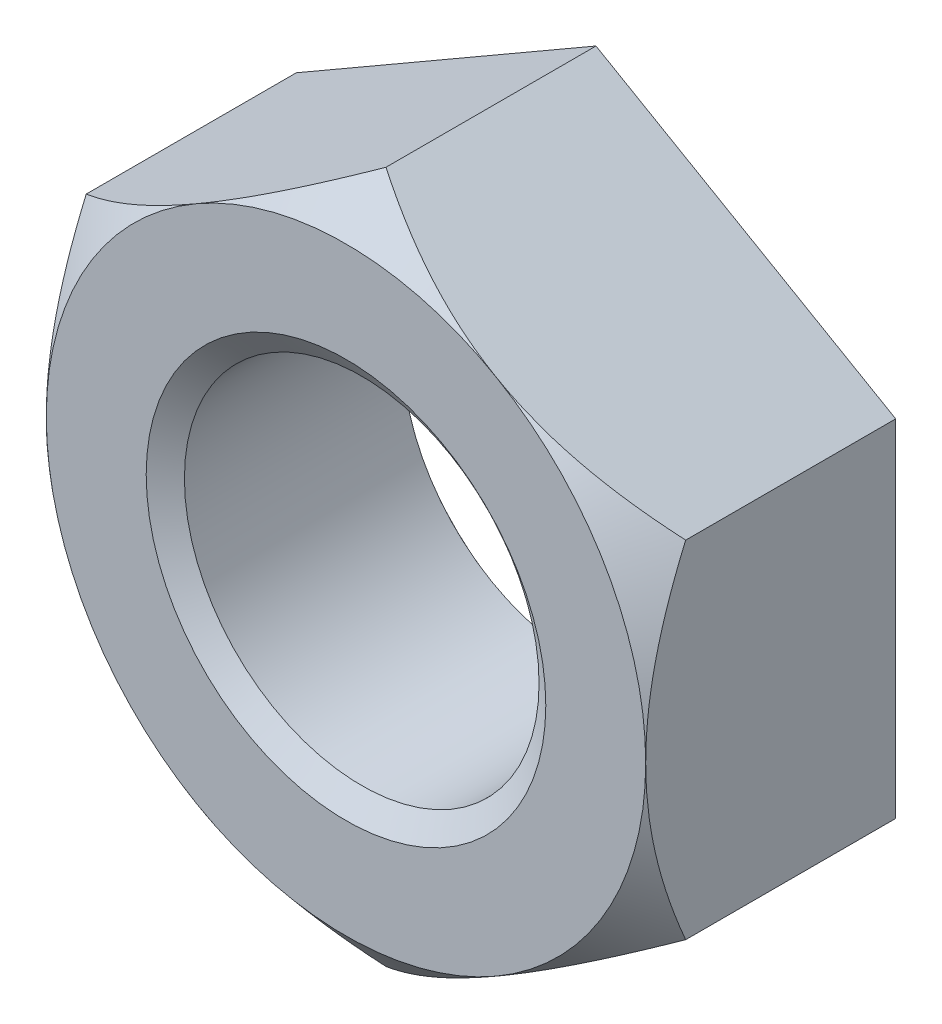
ISO-10303-21;
HEADER;
FILE_DESCRIPTION(('STEP AP214'),'2;1');
FILE_NAME('part.step','',(''),(''),'','','');
FILE_SCHEMA(('AUTOMOTIVE_DESIGN { 1 0 10303 214 1 1 1 1 }'));
ENDSEC;
DATA;
#1=APPLICATION_CONTEXT('core data for automotive mechanical design processes');
#2=APPLICATION_PROTOCOL_DEFINITION('international standard','automotive_design',2000,#1);
#3=PRODUCT_CONTEXT('',#1,'mechanical');
#4=PRODUCT('Part','Part','',(#3));
#5=PRODUCT_RELATED_PRODUCT_CATEGORY('part','',(#4));
#6=PRODUCT_DEFINITION_FORMATION('','',#4);
#7=PRODUCT_DEFINITION_CONTEXT('part definition',#1,'design');
#8=PRODUCT_DEFINITION('design','',#6,#7);
#9=PRODUCT_DEFINITION_SHAPE('','',#8);
#10=(LENGTH_UNIT() NAMED_UNIT(*) SI_UNIT(.MILLI.,.METRE.));
#11=(NAMED_UNIT(*) PLANE_ANGLE_UNIT() SI_UNIT($,.RADIAN.));
#12=(NAMED_UNIT(*) SI_UNIT($,.STERADIAN.) SOLID_ANGLE_UNIT());
#13=UNCERTAINTY_MEASURE_WITH_UNIT(LENGTH_MEASURE(1.E-05),#10,'distance_accuracy_value','');
#14=(GEOMETRIC_REPRESENTATION_CONTEXT(3) GLOBAL_UNCERTAINTY_ASSIGNED_CONTEXT((#13)) GLOBAL_UNIT_ASSIGNED_CONTEXT((#10,
#11,#12)) REPRESENTATION_CONTEXT('',''));
#15=CARTESIAN_POINT('',(0.,0.,0.));
#16=DIRECTION('',(0.,0.,1.));
#17=DIRECTION('',(1.,0.,0.));
#18=AXIS2_PLACEMENT_3D('',#15,#16,#17);
#19=CARTESIAN_POINT('',(0.,0.,-19.8628));
#20=DIRECTION('',(0.,0.,1.));
#21=DIRECTION('',(1.,0.,0.));
#22=AXIS2_PLACEMENT_3D('',#19,#20,#21);
#23=CYLINDRICAL_SURFACE('',#22,14.08938);
#24=CARTESIAN_POINT('',(0.,0.,-1.25030458437802));
#25=DIRECTION('',(0.,0.,1.));
#26=DIRECTION('',(1.,0.,0.));
#27=AXIS2_PLACEMENT_3D('',#24,#25,#26);
#28=CIRCLE('',#27,14.08938);
#29=CARTESIAN_POINT('',(14.08938,0.,-1.25030458437802));
#30=VERTEX_POINT('',#29);
#31=EDGE_CURVE('E130',#30,#30,#28,.F.);
#32=ORIENTED_EDGE('',*,*,#31,.F.);
#33=EDGE_LOOP('',(#32));
#34=FACE_BOUND('',#33,.T.);
#35=CARTESIAN_POINT('',(0.,0.,-18.587095415622));
#36=DIRECTION('',(0.,0.,-1.));
#37=DIRECTION('',(-1.,0.,0.));
#38=AXIS2_PLACEMENT_3D('',#35,#36,#37);
#39=CIRCLE('',#38,14.08938);
#40=CARTESIAN_POINT('',(-14.08938,0.,-18.587095415622));
#41=VERTEX_POINT('',#40);
#42=EDGE_CURVE('E37',#41,#41,#39,.F.);
#43=ORIENTED_EDGE('',*,*,#42,.F.);
#44=EDGE_LOOP('',(#43));
#45=FACE_BOUND('',#44,.T.);
#46=ADVANCED_FACE('F32',(#34,#45),#23,.F.);
#47=CARTESIAN_POINT('',(-47.625,0.,0.));
#48=DIRECTION('',(0.,0.,1.));
#49=DIRECTION('',(1.,0.,0.));
#50=AXIS2_PLACEMENT_3D('',#47,#48,#49);
#51=PLANE('',#50);
#52=CARTESIAN_POINT('',(0.,0.,0.));
#53=DIRECTION('',(0.,0.,1.));
#54=DIRECTION('',(1.,0.,0.));
#55=AXIS2_PLACEMENT_3D('',#52,#53,#54);
#56=CIRCLE('',#55,15.875);
#57=CARTESIAN_POINT('',(15.875,0.,0.));
#58=VERTEX_POINT('',#57);
#59=EDGE_CURVE('E217',#58,#58,#56,.T.);
#60=ORIENTED_EDGE('',*,*,#59,.F.);
#61=EDGE_LOOP('',(#60));
#62=FACE_BOUND('',#61,.T.);
#63=CARTESIAN_POINT('',(0.,0.,0.));
#64=DIRECTION('',(0.,0.,1.));
#65=DIRECTION('',(1.,0.,0.));
#66=AXIS2_PLACEMENT_3D('',#63,#64,#65);
#67=CIRCLE('',#66,23.8125);
#68=CARTESIAN_POINT('',(23.8125,0.,0.));
#69=VERTEX_POINT('',#68);
#70=CARTESIAN_POINT('',(11.90625,-20.6222299276169,0.));
#71=VERTEX_POINT('',#70);
#72=EDGE_CURVE('E11',#69,#71,#67,.F.);
#73=ORIENTED_EDGE('',*,*,#72,.F.);
#74=CARTESIAN_POINT('',(0.,0.,0.));
#75=DIRECTION('',(0.,0.,1.));
#76=DIRECTION('',(1.,0.,0.));
#77=AXIS2_PLACEMENT_3D('',#74,#75,#76);
#78=CIRCLE('',#77,23.8125);
#79=CARTESIAN_POINT('',(11.90625,20.6222299276169,0.));
#80=VERTEX_POINT('',#79);
#81=EDGE_CURVE('E122',#69,#80,#78,.T.);
#82=ORIENTED_EDGE('',*,*,#81,.T.);
#83=CARTESIAN_POINT('',(-11.90625,20.6222299276169,0.));
#84=VERTEX_POINT('',#83);
#85=EDGE_CURVE('E44',#84,#80,#67,.F.);
#86=ORIENTED_EDGE('',*,*,#85,.F.);
#87=CARTESIAN_POINT('',(-23.8125,0.,0.));
#88=VERTEX_POINT('',#87);
#89=EDGE_CURVE('E271',#88,#84,#67,.F.);
#90=ORIENTED_EDGE('',*,*,#89,.F.);
#91=CARTESIAN_POINT('',(-11.90625,-20.6222299276169,0.));
#92=VERTEX_POINT('',#91);
#93=EDGE_CURVE('E273',#92,#88,#67,.F.);
#94=ORIENTED_EDGE('',*,*,#93,.F.);
#95=EDGE_CURVE('E42',#71,#92,#67,.F.);
#96=ORIENTED_EDGE('',*,*,#95,.F.);
#97=EDGE_LOOP('',(#73,#82,#86,#90,#94,#96));
#98=FACE_BOUND('',#97,.T.);
#99=ADVANCED_FACE('F132',(#62,#98),#51,.T.);
#100=CARTESIAN_POINT('',(0.,27.4963065701559,-19.8628));
#101=DIRECTION('',(-0.500000000000001,0.866025403784438,0.));
#102=DIRECTION('',(-0.866025403784438,-0.500000000000001,0.));
#103=AXIS2_PLACEMENT_3D('',#100,#101,#102);
#104=PLANE('',#103);
#105=CARTESIAN_POINT('',(0.000200000000003434,27.4964220402098,-3.17509952198178));
#106=CARTESIAN_POINT('',(-0.466718423120004,27.2268465629319,-2.94279478592502));
#107=CARTESIAN_POINT('',(-0.936923396472342,26.9553735949926,-2.71902576822374));
#108=CARTESIAN_POINT('',(-1.88435346445879,26.4083745902023,-2.29132084119232));
#109=CARTESIAN_POINT('',(-2.36158251981904,26.1328462666249,-2.08739665700652));
#110=CARTESIAN_POINT('',(-3.32539928290253,25.5763863990092,-1.70144583138361));
#111=CARTESIAN_POINT('',(-3.81202219499538,25.2954345297185,-1.51953557504526));
#112=CARTESIAN_POINT('',(-4.79203527950639,24.7296237115667,-1.18210790703422));
#113=CARTESIAN_POINT('',(-5.28542430400652,24.4447654254564,-1.02658607681752));
#114=CARTESIAN_POINT('',(-6.26966313667821,23.8765148704665,-0.7477322807642));
#115=CARTESIAN_POINT('',(-6.76040037226601,23.5931875953985,-0.623874056647027));
#116=CARTESIAN_POINT('',(-7.74712449517678,23.0235021574201,-0.40776440783743));
#117=CARTESIAN_POINT('',(-8.2431115383921,22.7371439045051,-0.315513924462556));
#118=CARTESIAN_POINT('',(-9.23788424480358,22.162811614676,-0.165323367483307));
#119=CARTESIAN_POINT('',(-9.73666132623802,21.8748425324442,-0.107308092687464));
#120=CARTESIAN_POINT('',(-10.7363624948848,21.2976647936168,-0.0270201458826124));
#121=CARTESIAN_POINT('',(-11.2372864249349,21.0084562277588,-0.00474490083227938));
#122=CARTESIAN_POINT('',(-12.1693710220917,20.4703169346828,0.00281628220347572));
#123=CARTESIAN_POINT('',(-12.6005077366341,20.2214000364843,-0.00716781686863893));
#124=CARTESIAN_POINT('',(-13.4616806660812,19.7242016138492,-0.0538480430277428));
#125=CARTESIAN_POINT('',(-13.8917169174605,19.475920068354,-0.090543272963481));
#126=CARTESIAN_POINT('',(-14.7498446798435,18.9804797737431,-0.189848552410474));
#127=CARTESIAN_POINT('',(-15.1779345152297,18.7333219920456,-0.252477769028664));
#128=CARTESIAN_POINT('',(-16.0308619339534,18.2408841172462,-0.402307763910602));
#129=CARTESIAN_POINT('',(-16.4556994704088,17.9956040512118,-0.489508895697436));
#130=CARTESIAN_POINT('',(-17.3014196900154,17.5073272547628,-0.686791566889288));
#131=CARTESIAN_POINT('',(-17.7223017801118,17.2643308667486,-0.796876481896264));
#132=CARTESIAN_POINT('',(-18.5595580640108,16.7809407258588,-1.03800894613953));
#133=CARTESIAN_POINT('',(-18.9759315749561,16.5405473672311,-1.16905962466074));
#134=CARTESIAN_POINT('',(-20.2173718106498,15.8238015129705,-1.5905164984464));
#135=CARTESIAN_POINT('',(-21.0352961096522,15.3515726987648,-1.90935780647807));
#136=CARTESIAN_POINT('',(-22.1750858359255,14.6935147934813,-2.40175395806965));
#137=CARTESIAN_POINT('',(-22.5053698262145,14.5028252427789,-2.55026732199081));
#138=CARTESIAN_POINT('',(-23.1618377857794,14.1238132896097,-2.85617837307393));
#139=CARTESIAN_POINT('',(-23.4880302120516,13.9354860044939,-3.01355183659463));
#140=CARTESIAN_POINT('',(-23.8127,13.7480378150241,-3.17509952198175));
#141=B_SPLINE_CURVE_WITH_KNOTS('',3,(#105,#106,#107,#108,#109,#110,#111,#112,#113,#114,#115,
#116,#117,#118,#119,#120,#121,#122,#123,#124,#125,#126,#127,#128,#129,#130,#131,#132,#133,#134,
#135,#136,#137,#138,#139,#140),.UNSPECIFIED.,.F.,.F.,(4,2,2,2,2,2,2,2,2,2,2,2,2,2,2,2,2,4),(0.,
1.76129137020664,3.52361714482664,5.29488693411393,7.06585984425284,8.80513962614359,
10.5444712014326,12.2799677936642,14.0153394362277,15.5084329382446,17.0014762937924,
18.4956250923221,19.9897953886904,21.4841862477076,22.9788003633277,25.966130453619,
27.1938911893655,28.4184444357914),.UNSPECIFIED.);
#142=CARTESIAN_POINT('',(0.,27.4963065701559,-3.175));
#143=VERTEX_POINT('',#142);
#144=EDGE_CURVE('E182',#143,#84,#141,.T.);
#145=ORIENTED_EDGE('',*,*,#144,.F.);
#146=DIRECTION('',(0.,0.,1.));
#147=VECTOR('',#146,1.);
#148=CARTESIAN_POINT('',(0.,27.4963065701559,-19.8628));
#149=LINE('',#148,#147);
#150=CARTESIAN_POINT('',(0.,27.4963065701559,-19.8628));
#151=VERTEX_POINT('',#150);
#152=EDGE_CURVE('E241',#151,#143,#149,.T.);
#153=ORIENTED_EDGE('',*,*,#152,.F.);
#154=DIRECTION('',(-0.866025403784438,-0.500000000000001,0.));
#155=VECTOR('',#154,1.);
#156=CARTESIAN_POINT('',(0.,27.4963065701559,-19.8628));
#157=LINE('',#156,#155);
#158=CARTESIAN_POINT('',(-23.8125,13.7481532850779,-19.8628));
#159=VERTEX_POINT('',#158);
#160=EDGE_CURVE('E138',#151,#159,#157,.T.);
#161=ORIENTED_EDGE('',*,*,#160,.T.);
#162=DIRECTION('',(0.,0.,1.));
#163=VECTOR('',#162,1.);
#164=CARTESIAN_POINT('',(-23.8125,13.7481532850779,-19.8628));
#165=LINE('',#164,#163);
#166=CARTESIAN_POINT('',(-23.8125,13.748153285078,-3.175));
#167=VERTEX_POINT('',#166);
#168=EDGE_CURVE('E228',#159,#167,#165,.T.);
#169=ORIENTED_EDGE('',*,*,#168,.T.);
#170=EDGE_CURVE('E177',#84,#167,#141,.T.);
#171=ORIENTED_EDGE('',*,*,#170,.F.);
#172=EDGE_LOOP('',(#145,#153,#161,#169,#171));
#173=FACE_BOUND('',#172,.T.);
#174=ADVANCED_FACE('F34',(#173),#104,.T.);
#175=CARTESIAN_POINT('',(23.8125,13.7481532850779,-19.8628));
#176=DIRECTION('',(0.500000000000001,0.866025403784438,0.));
#177=DIRECTION('',(-0.866025403784438,0.500000000000001,0.));
#178=AXIS2_PLACEMENT_3D('',#175,#176,#177);
#179=PLANE('',#178);
#180=CARTESIAN_POINT('',(23.8127,13.7480378150241,-3.17509952198175));
#181=CARTESIAN_POINT('',(23.34578157688,14.017613292302,-2.942794785925));
#182=CARTESIAN_POINT('',(22.8755766035277,14.2890862602413,-2.71902576822372));
#183=CARTESIAN_POINT('',(21.9281465355412,14.8360852650316,-2.29132084119231));
#184=CARTESIAN_POINT('',(21.450917480181,15.111613588609,-2.0873966570065));
#185=CARTESIAN_POINT('',(20.4871007170975,15.6680734562247,-1.7014458313836));
#186=CARTESIAN_POINT('',(20.0004778050046,15.9490253255154,-1.51953557504525));
#187=CARTESIAN_POINT('',(19.0204647204936,16.5148361436671,-1.18210790703421));
#188=CARTESIAN_POINT('',(18.5270756959935,16.7996944297775,-1.02658607681751));
#189=CARTESIAN_POINT('',(17.5428368633218,17.3679449847674,-0.74773228076419));
#190=CARTESIAN_POINT('',(17.052099627734,17.6512722598354,-0.623874056647018));
#191=CARTESIAN_POINT('',(16.0653755048232,18.2209576978138,-0.407764407837423));
#192=CARTESIAN_POINT('',(15.5693884616079,18.5073159507287,-0.315513924462549));
#193=CARTESIAN_POINT('',(14.5746157551964,19.0816482405579,-0.165323367483302));
#194=CARTESIAN_POINT('',(14.075838673762,19.3696173227897,-0.107308092687459));
#195=CARTESIAN_POINT('',(13.0761375051152,19.9467950616171,-0.0270201458826089));
#196=CARTESIAN_POINT('',(12.5752135750651,20.236003627475,-0.00474490083227695));
#197=CARTESIAN_POINT('',(11.6431289779083,20.774142920551,0.00281628220347861));
#198=CARTESIAN_POINT('',(11.2119922633659,21.0230598187496,-0.00716781686863493));
#199=CARTESIAN_POINT('',(10.3508193339189,21.5202582413847,-0.0538480430277385));
#200=CARTESIAN_POINT('',(9.92078308253951,21.7685397868798,-0.0905432729634776));
#201=CARTESIAN_POINT('',(9.06265532015658,22.2639800814907,-0.189848552410469));
#202=CARTESIAN_POINT('',(8.63456548477036,22.5111378631883,-0.252477769028656));
#203=CARTESIAN_POINT('',(7.78163806604667,23.0035757379876,-0.402307763910594));
#204=CARTESIAN_POINT('',(7.35680052959128,23.248855804022,-0.489508895697431));
#205=CARTESIAN_POINT('',(6.51108030998462,23.737132600471,-0.686791566889284));
#206=CARTESIAN_POINT('',(6.09019821988823,23.9801289884853,-0.796876481896258));
#207=CARTESIAN_POINT('',(5.25294193598927,24.463519129375,-1.03800894613953));
#208=CARTESIAN_POINT('',(4.83656842504394,24.7039124880028,-1.16905962466073));
#209=CARTESIAN_POINT('',(3.59512818935028,25.4206583422633,-1.5905164984464));
#210=CARTESIAN_POINT('',(2.77720389034788,25.8928871564691,-1.90935780647806));
#211=CARTESIAN_POINT('',(1.63741416407456,26.5509450617526,-2.40175395806964));
#212=CARTESIAN_POINT('',(1.30713017378556,26.741634612455,-2.55026732199081));
#213=CARTESIAN_POINT('',(0.650662214220596,27.1206465656242,-2.85617837307394));
#214=CARTESIAN_POINT('',(0.324469787948428,27.30897385074,-3.01355183659465));
#215=CARTESIAN_POINT('',(-0.000199999999996433,27.4964220402098,-3.17509952198177));
#216=B_SPLINE_CURVE_WITH_KNOTS('',3,(#180,#181,#182,#183,#184,#185,#186,#187,#188,#189,#190,
#191,#192,#193,#194,#195,#196,#197,#198,#199,#200,#201,#202,#203,#204,#205,#206,#207,#208,#209,
#210,#211,#212,#213,#214,#215),.UNSPECIFIED.,.F.,.F.,(4,2,2,2,2,2,2,2,2,2,2,2,2,2,2,2,2,4),(0.,
1.76129137020664,3.52361714482663,5.29488693411392,7.06585984425282,8.80513962614357,
10.5444712014326,12.2799677936641,14.0153394362277,15.5084329382446,17.0014762937924,
18.4956250923221,19.9897953886904,21.4841862477075,22.9788003633276,25.9661304536189,
27.1938911893655,28.4184444357914),.UNSPECIFIED.);
#217=CARTESIAN_POINT('',(23.8125,13.748153285078,-3.175));
#218=VERTEX_POINT('',#217);
#219=EDGE_CURVE('E125',#218,#80,#216,.T.);
#220=ORIENTED_EDGE('',*,*,#219,.F.);
#221=DIRECTION('',(0.,0.,1.));
#222=VECTOR('',#221,1.);
#223=CARTESIAN_POINT('',(23.8125,13.7481532850779,-19.8628));
#224=LINE('',#223,#222);
#225=CARTESIAN_POINT('',(23.8125,13.7481532850779,-19.8628));
#226=VERTEX_POINT('',#225);
#227=EDGE_CURVE('E137',#226,#218,#224,.T.);
#228=ORIENTED_EDGE('',*,*,#227,.F.);
#229=DIRECTION('',(-0.866025403784438,0.500000000000001,0.));
#230=VECTOR('',#229,1.);
#231=CARTESIAN_POINT('',(23.8125,13.7481532850779,-19.8628));
#232=LINE('',#231,#230);
#233=EDGE_CURVE('E232',#226,#151,#232,.T.);
#234=ORIENTED_EDGE('',*,*,#233,.T.);
#235=ORIENTED_EDGE('',*,*,#152,.T.);
#236=EDGE_CURVE('E148',#80,#143,#216,.T.);
#237=ORIENTED_EDGE('',*,*,#236,.F.);
#238=EDGE_LOOP('',(#220,#228,#234,#235,#237));
#239=FACE_BOUND('',#238,.T.);
#240=ADVANCED_FACE('F163',(#239),#179,.T.);
#241=CARTESIAN_POINT('',(23.8125,13.7481532850779,-19.8628));
#242=DIRECTION('',(-1.,0.,0.));
#243=DIRECTION('',(0.,0.,1.));
#244=AXIS2_PLACEMENT_3D('',#241,#242,#243);
#245=PLANE('',#244);
#246=ORIENTED_EDGE('',*,*,#227,.T.);
#247=CARTESIAN_POINT('',(23.8125,-30.4323844218243,-12.7808178725856));
#248=CARTESIAN_POINT('',(23.8125,-30.0474390087049,-12.5195293156086));
#249=CARTESIAN_POINT('',(23.8125,-29.6616238171824,-12.2595230544893));
#250=CARTESIAN_POINT('',(23.8125,-28.8881005904126,-11.7423291562001));
#251=CARTESIAN_POINT('',(23.8125,-28.5003925258806,-11.4851415628388));
#252=CARTESIAN_POINT('',(23.8125,-27.3340565976566,-10.718094437167));
#253=CARTESIAN_POINT('',(23.8125,-26.5523757682604,-10.2128586224691));
#254=CARTESIAN_POINT('',(23.8125,-24.9739677922019,-9.21378302827618));
#255=CARTESIAN_POINT('',(23.8125,-24.1771732523839,-8.72004948317257));
#256=CARTESIAN_POINT('',(23.8125,-22.5724061730182,-7.75115027105292));
#257=CARTESIAN_POINT('',(23.8125,-21.7644343420741,-7.27598343420675));
#258=CARTESIAN_POINT('',(23.8125,-20.0912004275222,-6.32339637981762));
#259=CARTESIAN_POINT('',(23.8125,-19.2252082244681,-5.84725230552591));
#260=CARTESIAN_POINT('',(23.8125,-17.4760714392847,-4.92703111781975));
#261=CARTESIAN_POINT('',(23.8125,-16.5929243668725,-4.48295870489784));
#262=CARTESIAN_POINT('',(23.8125,-14.809519718372,-3.63687523908924));
#263=CARTESIAN_POINT('',(23.8125,-13.909315235506,-3.2347530307613));
#264=CARTESIAN_POINT('',(23.8125,-12.0875146671183,-2.48245763633098));
#265=CARTESIAN_POINT('',(23.8125,-11.165927594057,-2.13226300748588));
#266=CARTESIAN_POINT('',(23.8125,-9.77991549102575,-1.66062210777044));
#267=CARTESIAN_POINT('',(23.8125,-9.32396739825675,-1.51411347413399));
#268=CARTESIAN_POINT('',(23.8125,-8.4068690487437,-1.23832850147327));
#269=CARTESIAN_POINT('',(23.8125,-7.94571894757357,-1.10905164858067));
#270=CARTESIAN_POINT('',(23.8125,-7.0184582975614,-0.869488526642372));
#271=CARTESIAN_POINT('',(23.8125,-6.55234739804443,-0.759203609716872));
#272=CARTESIAN_POINT('',(23.8125,-5.61570737540475,-0.559369292170362));
#273=CARTESIAN_POINT('',(23.8125,-5.14517852806323,-0.469818606095366));
#274=CARTESIAN_POINT('',(23.8125,-4.20918018448069,-0.314477754262728));
#275=CARTESIAN_POINT('',(23.8125,-3.74377915059328,-0.248276981723377));
#276=CARTESIAN_POINT('',(23.8125,-2.81029538909379,-0.138591078645598));
#277=CARTESIAN_POINT('',(23.8125,-2.3422126828307,-0.0951057675209481));
#278=CARTESIAN_POINT('',(23.8125,-1.40448447699556,-0.0317203477280015));
#279=CARTESIAN_POINT('',(23.8125,-0.934839113815322,-0.011818232155553));
#280=CARTESIAN_POINT('',(23.8125,0.00485402602932956,0.00399308521144211));
#281=CARTESIAN_POINT('',(23.8125,0.474901796776851,-9.73660726508058E-05));
#282=CARTESIAN_POINT('',(23.8125,1.38277005244922,-0.0311081918136299));
#283=CARTESIAN_POINT('',(23.8125,1.82064434208716,-0.0564841195218105));
#284=CARTESIAN_POINT('',(23.8125,2.69472474579546,-0.127591271578368));
#285=CARTESIAN_POINT('',(23.8125,3.13093088385809,-0.173322202050942));
#286=CARTESIAN_POINT('',(23.8125,4.00085005345835,-0.28435935484037));
#287=CARTESIAN_POINT('',(23.8125,4.43456297997539,-0.349666395685));
#288=CARTESIAN_POINT('',(23.8125,5.29878073895378,-0.498811366424694));
#289=CARTESIAN_POINT('',(23.8125,5.72928553425685,-0.582649510613117));
#290=CARTESIAN_POINT('',(23.8125,6.59545086697381,-0.769553307458787));
#291=CARTESIAN_POINT('',(23.8125,7.03103272697838,-0.872982204517741));
#292=CARTESIAN_POINT('',(23.8125,7.8978968863694,-1.09646126904023));
#293=CARTESIAN_POINT('',(23.8125,8.32917914752467,-1.21651158415708));
#294=CARTESIAN_POINT('',(23.8125,9.18710428183968,-1.47175458298606));
#295=CARTESIAN_POINT('',(23.8125,9.61374832161203,-1.6069433576268));
#296=CARTESIAN_POINT('',(23.8125,10.4623987932086,-1.89106533241212));
#297=CARTESIAN_POINT('',(23.8125,10.8844053503237,-2.03999816020704));
#298=CARTESIAN_POINT('',(23.8125,12.0723898664415,-2.47908631211642));
#299=CARTESIAN_POINT('',(23.8125,12.833002884352,-2.78381459326361));
#300=CARTESIAN_POINT('',(23.8125,14.3397528430197,-3.42737144256846));
#301=CARTESIAN_POINT('',(23.8125,15.0858855682189,-3.76620976847905));
#302=CARTESIAN_POINT('',(23.8125,16.5656183702001,-4.47211487845766));
#303=CARTESIAN_POINT('',(23.8125,17.2992037883158,-4.83921224552717));
#304=CARTESIAN_POINT('',(23.8125,18.7543705077777,-5.59621376151349));
#305=CARTESIAN_POINT('',(23.8125,19.4759528440962,-5.98611593084338));
#306=CARTESIAN_POINT('',(23.8125,20.9129364488905,-6.78712116819982));
#307=CARTESIAN_POINT('',(23.8125,21.6282740205368,-7.19833810823166));
#308=CARTESIAN_POINT('',(23.8125,23.0496605364422,-8.03650642864274));
#309=CARTESIAN_POINT('',(23.8125,23.7557093130458,-8.4634580924941));
#310=CARTESIAN_POINT('',(23.8125,25.159303351097,-9.33022426232277));
#311=CARTESIAN_POINT('',(23.8125,25.8568531407255,-9.77003145260993));
#312=CARTESIAN_POINT('',(23.8125,27.2448815812637,-10.6606333720463));
#313=CARTESIAN_POINT('',(23.8125,27.935360293608,-11.1114280056195));
#314=CARTESIAN_POINT('',(23.8125,29.2422431890045,-11.9773285554616));
#315=CARTESIAN_POINT('',(23.8125,29.8592270657755,-12.3915611367883));
#316=CARTESIAN_POINT('',(23.8125,31.0887545710361,-13.2265724291721));
#317=CARTESIAN_POINT('',(23.8125,31.7012981540575,-13.6473512071231));
#318=CARTESIAN_POINT('',(23.8125,32.9225100151001,-14.4946567875428));
#319=CARTESIAN_POINT('',(23.8125,33.5311777841474,-14.921184322919));
#320=CARTESIAN_POINT('',(23.8125,34.7449895547688,-15.7792251453113));
#321=CARTESIAN_POINT('',(23.8125,35.3501335442542,-16.2107384494163));
#322=CARTESIAN_POINT('',(23.8125,36.5492875183747,-17.0724138266066));
#323=CARTESIAN_POINT('',(23.8125,37.143338914469,-17.5025183066712));
#324=CARTESIAN_POINT('',(23.8125,38.3286863139299,-18.3665082936818));
#325=CARTESIAN_POINT('',(23.8125,38.9199823116463,-18.8003938083758));
#326=CARTESIAN_POINT('',(23.8125,40.0999391067155,-19.6714092367432));
#327=CARTESIAN_POINT('',(23.8125,40.6886005538894,-20.1085382706191));
#328=CARTESIAN_POINT('',(23.8125,41.8636728307988,-20.9857993488411));
#329=CARTESIAN_POINT('',(23.8125,42.4500836829561,-21.425931363148));
#330=CARTESIAN_POINT('',(23.8125,43.0354894598874,-21.8673923669117));
#331=B_SPLINE_CURVE_WITH_KNOTS('',3,(#247,#248,#249,#250,#251,#252,#253,#254,#255,#256,#257,
#258,#259,#260,#261,#262,#263,#264,#265,#266,#267,#268,#269,#270,#271,#272,#273,#274,#275,#276,
#277,#278,#279,#280,#281,#282,#283,#284,#285,#286,#287,#288,#289,#290,#291,#292,#293,#294,#295,
#296,#297,#298,#299,#300,#301,#302,#303,#304,#305,#306,#307,#308,#309,#310,#311,#312,#313,#314,
#315,#316,#317,#318,#319,#320,#321,#322,#323,#324,#325,#326,#327,#328,#329,#330),.UNSPECIFIED.,
.F.,.F.,(4,2,2,2,2,2,2,2,2,2,2,2,2,2,2,2,2,2,2,2,2,2,2,2,2,2,2,2,2,2,2,2,2,2,2,2,2,2,2,2,2,4),
(0.,1.39573592617882,2.79149351458839,5.58358479765353,8.3954779132195,11.2071935735825,
14.1714415837286,17.1361231625689,20.0927382674306,23.0481290604297,24.4845779539303,
25.9209840015515,27.3574922710533,28.7939114579152,30.2036384134847,31.6133541616596,
33.0229499359484,34.4325253281881,35.7478714209976,37.0631985240848,38.3785806320715,
39.6939779519101,41.036700771958,42.3794355206031,43.7218243427159,45.0641768079122,
47.5212119755649,49.9789520277329,52.4393903797403,54.8996154677371,57.3747067056577,
59.8498425559071,62.3235962993752,64.7973285321813,67.0267035006115,69.256101265461,
71.4857859958541,73.7154783708644,75.9156850354913,78.1158962098163,80.3155309405866,
82.5151437002031),.UNSPECIFIED.);
#332=EDGE_CURVE('E117',#218,#69,#331,.F.);
#333=ORIENTED_EDGE('',*,*,#332,.T.);
#334=CARTESIAN_POINT('',(23.8125,-13.748153285078,-3.175));
#335=VERTEX_POINT('',#334);
#336=EDGE_CURVE('E106',#69,#335,#331,.F.);
#337=ORIENTED_EDGE('',*,*,#336,.T.);
#338=DIRECTION('',(0.,0.,1.));
#339=VECTOR('',#338,1.);
#340=CARTESIAN_POINT('',(23.8125,-13.748153285078,-19.8628));
#341=LINE('',#340,#339);
#342=CARTESIAN_POINT('',(23.8125,-13.748153285078,-19.8628));
#343=VERTEX_POINT('',#342);
#344=EDGE_CURVE('E238',#343,#335,#341,.T.);
#345=ORIENTED_EDGE('',*,*,#344,.F.);
#346=DIRECTION('',(0.,-1.,0.));
#347=VECTOR('',#346,1.);
#348=CARTESIAN_POINT('',(23.8125,13.7481532850779,-19.8628));
#349=LINE('',#348,#347);
#350=EDGE_CURVE('E246',#226,#343,#349,.T.);
#351=ORIENTED_EDGE('',*,*,#350,.F.);
#352=EDGE_LOOP('',(#246,#333,#337,#345,#351));
#353=FACE_BOUND('',#352,.T.);
#354=ADVANCED_FACE('F135',(#353),#245,.F.);
#355=CARTESIAN_POINT('',(0.,-27.496306570156,-19.8628));
#356=DIRECTION('',(0.500000000000001,-0.866025403784438,0.));
#357=DIRECTION('',(0.866025403784438,0.500000000000001,0.));
#358=AXIS2_PLACEMENT_3D('',#355,#356,#357);
#359=PLANE('',#358);
#360=CARTESIAN_POINT('',(-0.000200000000002101,-27.4964220402098,-3.17509952198183));
#361=CARTESIAN_POINT('',(0.466718423120009,-27.2268465629319,-2.94279478592508));
#362=CARTESIAN_POINT('',(0.936923396472348,-26.9553735949926,-2.7190257682238));
#363=CARTESIAN_POINT('',(1.8843534644588,-26.4083745902023,-2.29132084119238));
#364=CARTESIAN_POINT('',(2.36158251981905,-26.132846266625,-2.08739665700657));
#365=CARTESIAN_POINT('',(3.32539928290254,-25.5763863990092,-1.70144583138366));
#366=CARTESIAN_POINT('',(3.81202219499539,-25.2954345297186,-1.51953557504531));
#367=CARTESIAN_POINT('',(4.79203527950641,-24.7296237115668,-1.18210790703427));
#368=CARTESIAN_POINT('',(5.28542430400654,-24.4447654254564,-1.02658607681757));
#369=CARTESIAN_POINT('',(6.26966313667824,-23.8765148704665,-0.747732280764246));
#370=CARTESIAN_POINT('',(6.76040037226604,-23.5931875953986,-0.623874056647072));
#371=CARTESIAN_POINT('',(7.74712449517681,-23.0235021574201,-0.407764407837474));
#372=CARTESIAN_POINT('',(8.24311153839213,-22.7371439045052,-0.315513924462599));
#373=CARTESIAN_POINT('',(9.23788424480361,-22.162811614676,-0.165323367483351));
#374=CARTESIAN_POINT('',(9.73666132623805,-21.8748425324442,-0.107308092687509));
#375=CARTESIAN_POINT('',(10.7363624948849,-21.2976647936168,-0.0270201458826572));
#376=CARTESIAN_POINT('',(11.237286424935,-21.0084562277589,-0.0047449008323236));
#377=CARTESIAN_POINT('',(12.1693710220918,-20.4703169346829,0.00281628220343039));
#378=CARTESIAN_POINT('',(12.6005077366341,-20.2214000364843,-0.00716781686868565));
#379=CARTESIAN_POINT('',(13.4616806660812,-19.7242016138492,-0.0538480430277909));
#380=CARTESIAN_POINT('',(13.8917169174606,-19.475920068354,-0.0905432729635292));
#381=CARTESIAN_POINT('',(14.7498446798435,-18.9804797737432,-0.18984855241052));
#382=CARTESIAN_POINT('',(15.1779345152297,-18.7333219920456,-0.252477769028708));
#383=CARTESIAN_POINT('',(16.0308619339534,-18.2408841172462,-0.402307763910645));
#384=CARTESIAN_POINT('',(16.4556994704088,-17.9956040512119,-0.48950889569748));
#385=CARTESIAN_POINT('',(17.3014196900155,-17.5073272547629,-0.686791566889334));
#386=CARTESIAN_POINT('',(17.7223017801119,-17.2643308667486,-0.796876481896309));
#387=CARTESIAN_POINT('',(18.5595580640108,-16.7809407258588,-1.03800894613958));
#388=CARTESIAN_POINT('',(18.9759315749562,-16.5405473672311,-1.16905962466078));
#389=CARTESIAN_POINT('',(20.2173718106498,-15.8238015129705,-1.59051649844645));
#390=CARTESIAN_POINT('',(21.0352961096522,-15.3515726987648,-1.90935780647812));
#391=CARTESIAN_POINT('',(22.1750858359255,-14.6935147934813,-2.4017539580697));
#392=CARTESIAN_POINT('',(22.5053698262145,-14.5028252427789,-2.55026732199085));
#393=CARTESIAN_POINT('',(23.1618377857794,-14.1238132896098,-2.85617837307396));
#394=CARTESIAN_POINT('',(23.4880302120516,-13.9354860044939,-3.01355183659466));
#395=CARTESIAN_POINT('',(23.8127,-13.7480378150242,-3.17509952198178));
#396=B_SPLINE_CURVE_WITH_KNOTS('',3,(#360,#361,#362,#363,#364,#365,#366,#367,#368,#369,#370,
#371,#372,#373,#374,#375,#376,#377,#378,#379,#380,#381,#382,#383,#384,#385,#386,#387,#388,#389,
#390,#391,#392,#393,#394,#395),.UNSPECIFIED.,.F.,.F.,(4,2,2,2,2,2,2,2,2,2,2,2,2,2,2,2,2,4),(0.,
1.76129137020665,3.52361714482665,5.29488693411395,7.06585984425286,8.80513962614363,
10.5444712014327,12.2799677936642,14.0153394362278,15.5084329382447,17.0014762937925,
18.4956250923222,19.9897953886905,21.4841862477076,22.9788003633277,25.966130453619,
27.1938911893655,28.4184444357914),.UNSPECIFIED.);
#397=CARTESIAN_POINT('',(-1.2490009027033E-13,-27.4963065701559,-3.175));
#398=VERTEX_POINT('',#397);
#399=EDGE_CURVE('E51',#398,#71,#396,.T.);
#400=ORIENTED_EDGE('',*,*,#399,.F.);
#401=DIRECTION('',(0.,0.,1.));
#402=VECTOR('',#401,1.);
#403=CARTESIAN_POINT('',(0.,-27.496306570156,-19.8628));
#404=LINE('',#403,#402);
#405=CARTESIAN_POINT('',(0.,-27.496306570156,-19.8628));
#406=VERTEX_POINT('',#405);
#407=EDGE_CURVE('E235',#406,#398,#404,.T.);
#408=ORIENTED_EDGE('',*,*,#407,.F.);
#409=DIRECTION('',(0.866025403784438,0.500000000000001,0.));
#410=VECTOR('',#409,1.);
#411=CARTESIAN_POINT('',(0.,-27.496306570156,-19.8628));
#412=LINE('',#411,#410);
#413=EDGE_CURVE('E248',#406,#343,#412,.T.);
#414=ORIENTED_EDGE('',*,*,#413,.T.);
#415=ORIENTED_EDGE('',*,*,#344,.T.);
#416=EDGE_CURVE('E112',#71,#335,#396,.T.);
#417=ORIENTED_EDGE('',*,*,#416,.F.);
#418=EDGE_LOOP('',(#400,#408,#414,#415,#417));
#419=FACE_BOUND('',#418,.T.);
#420=ADVANCED_FACE('F162',(#419),#359,.T.);
#421=CARTESIAN_POINT('',(-23.8125,-13.748153285078,-19.8628));
#422=DIRECTION('',(-0.500000000000001,-0.866025403784438,0.));
#423=DIRECTION('',(0.866025403784438,-0.500000000000001,0.));
#424=AXIS2_PLACEMENT_3D('',#421,#422,#423);
#425=PLANE('',#424);
#426=CARTESIAN_POINT('',(-23.8127,-13.7480378150242,-3.17509952198177));
#427=CARTESIAN_POINT('',(-23.34578157688,-14.0176132923021,-2.94279478592503));
#428=CARTESIAN_POINT('',(-22.8755766035277,-14.2890862602414,-2.71902576822375));
#429=CARTESIAN_POINT('',(-21.9281465355412,-14.8360852650317,-2.29132084119233));
#430=CARTESIAN_POINT('',(-21.450917480181,-15.111613588609,-2.08739665700653));
#431=CARTESIAN_POINT('',(-20.4871007170975,-15.6680734562248,-1.70144583138363));
#432=CARTESIAN_POINT('',(-20.0004778050046,-15.9490253255154,-1.51953557504528));
#433=CARTESIAN_POINT('',(-19.0204647204936,-16.5148361436672,-1.18210790703424));
#434=CARTESIAN_POINT('',(-18.5270756959935,-16.7996944297776,-1.02658607681755));
#435=CARTESIAN_POINT('',(-17.5428368633218,-17.3679449847674,-0.747732280764226));
#436=CARTESIAN_POINT('',(-17.052099627734,-17.6512722598354,-0.623874056647055));
#437=CARTESIAN_POINT('',(-16.0653755048232,-18.2209576978139,-0.407764407837463));
#438=CARTESIAN_POINT('',(-15.5693884616079,-18.5073159507288,-0.315513924462592));
#439=CARTESIAN_POINT('',(-14.5746157551965,-19.0816482405579,-0.165323367483348));
#440=CARTESIAN_POINT('',(-14.075838673762,-19.3696173227897,-0.107308092687506));
#441=CARTESIAN_POINT('',(-13.0761375051152,-19.9467950616172,-0.0270201458826563));
#442=CARTESIAN_POINT('',(-12.5752135750651,-20.2360036274751,-0.00474490083232375));
#443=CARTESIAN_POINT('',(-11.6431289779083,-20.7741429205511,0.00281628220343095));
#444=CARTESIAN_POINT('',(-11.211992263366,-21.0230598187496,-0.00716781686868395));
#445=CARTESIAN_POINT('',(-10.3508193339189,-21.5202582413847,-0.0538480430277895));
#446=CARTESIAN_POINT('',(-9.92078308253953,-21.7685397868799,-0.0905432729635289));
#447=CARTESIAN_POINT('',(-9.0626553201566,-22.2639800814908,-0.18984855241052));
#448=CARTESIAN_POINT('',(-8.63456548477038,-22.5111378631884,-0.252477769028708));
#449=CARTESIAN_POINT('',(-7.78163806604669,-23.0035757379877,-0.402307763910647));
#450=CARTESIAN_POINT('',(-7.3568005295913,-23.2488558040221,-0.489508895697484));
#451=CARTESIAN_POINT('',(-6.51108030998464,-23.7371326004711,-0.686791566889336));
#452=CARTESIAN_POINT('',(-6.09019821988825,-23.9801289884853,-0.796876481896307));
#453=CARTESIAN_POINT('',(-5.25294193598929,-24.4635191293751,-1.03800894613957));
#454=CARTESIAN_POINT('',(-4.83656842504396,-24.7039124880028,-1.16905962466078));
#455=CARTESIAN_POINT('',(-3.5951281893503,-25.4206583422634,-1.59051649844645));
#456=CARTESIAN_POINT('',(-2.7772038903479,-25.8928871564692,-1.90935780647811));
#457=CARTESIAN_POINT('',(-1.63741416407458,-26.5509450617526,-2.4017539580697));
#458=CARTESIAN_POINT('',(-1.30713017378557,-26.741634612455,-2.55026732199086));
#459=CARTESIAN_POINT('',(-0.650662214220598,-27.1206465656242,-2.85617837307399));
#460=CARTESIAN_POINT('',(-0.324469787948428,-27.3089738507401,-3.0135518365947));
#461=CARTESIAN_POINT('',(0.000199999999997262,-27.4964220402098,-3.17509952198183));
#462=B_SPLINE_CURVE_WITH_KNOTS('',3,(#426,#427,#428,#429,#430,#431,#432,#433,#434,#435,#436,
#437,#438,#439,#440,#441,#442,#443,#444,#445,#446,#447,#448,#449,#450,#451,#452,#453,#454,#455,
#456,#457,#458,#459,#460,#461),.UNSPECIFIED.,.F.,.F.,(4,2,2,2,2,2,2,2,2,2,2,2,2,2,2,2,2,4),(0.,
1.76129137020663,3.52361714482662,5.29488693411391,7.06585984425281,8.80513962614356,
10.5444712014326,12.2799677936641,14.0153394362277,15.5084329382446,17.0014762937923,
18.4956250923221,19.9897953886904,21.4841862477075,22.9788003633276,25.9661304536189,
27.1938911893655,28.4184444357914),.UNSPECIFIED.);
#463=CARTESIAN_POINT('',(-23.8125,-13.748153285078,-3.175));
#464=VERTEX_POINT('',#463);
#465=EDGE_CURVE('E58',#464,#92,#462,.T.);
#466=ORIENTED_EDGE('',*,*,#465,.F.);
#467=DIRECTION('',(0.,0.,1.));
#468=VECTOR('',#467,1.);
#469=CARTESIAN_POINT('',(-23.8125,-13.748153285078,-19.8628));
#470=LINE('',#469,#468);
#471=CARTESIAN_POINT('',(-23.8125,-13.748153285078,-19.8628));
#472=VERTEX_POINT('',#471);
#473=EDGE_CURVE('E231',#472,#464,#470,.T.);
#474=ORIENTED_EDGE('',*,*,#473,.F.);
#475=DIRECTION('',(0.866025403784438,-0.500000000000001,0.));
#476=VECTOR('',#475,1.);
#477=CARTESIAN_POINT('',(-23.8125,-13.748153285078,-19.8628));
#478=LINE('',#477,#476);
#479=EDGE_CURVE('E251',#472,#406,#478,.T.);
#480=ORIENTED_EDGE('',*,*,#479,.T.);
#481=ORIENTED_EDGE('',*,*,#407,.T.);
#482=EDGE_CURVE('E176',#92,#398,#462,.T.);
#483=ORIENTED_EDGE('',*,*,#482,.F.);
#484=EDGE_LOOP('',(#466,#474,#480,#481,#483));
#485=FACE_BOUND('',#484,.T.);
#486=ADVANCED_FACE('F169',(#485),#425,.T.);
#487=CARTESIAN_POINT('',(-23.8125,13.7481532850779,-19.8628));
#488=DIRECTION('',(-1.,0.,0.));
#489=DIRECTION('',(0.,0.,1.));
#490=AXIS2_PLACEMENT_3D('',#487,#488,#489);
#491=PLANE('',#490);
#492=CARTESIAN_POINT('',(-23.8125,-30.4323844218243,-12.7808178725856));
#493=CARTESIAN_POINT('',(-23.8125,-30.0474390087049,-12.5195293156086));
#494=CARTESIAN_POINT('',(-23.8125,-29.6616238171824,-12.2595230544893));
#495=CARTESIAN_POINT('',(-23.8125,-28.8881005904126,-11.7423291562001));
#496=CARTESIAN_POINT('',(-23.8125,-28.5003925258806,-11.4851415628388));
#497=CARTESIAN_POINT('',(-23.8125,-27.3340565976566,-10.718094437167));
#498=CARTESIAN_POINT('',(-23.8125,-26.5523757682604,-10.2128586224691));
#499=CARTESIAN_POINT('',(-23.8125,-24.9739677922019,-9.21378302827618));
#500=CARTESIAN_POINT('',(-23.8125,-24.1771732523839,-8.72004948317257));
#501=CARTESIAN_POINT('',(-23.8125,-22.5724061730182,-7.75115027105291));
#502=CARTESIAN_POINT('',(-23.8125,-21.7644343420741,-7.27598343420675));
#503=CARTESIAN_POINT('',(-23.8125,-20.0912004275222,-6.32339637981762));
#504=CARTESIAN_POINT('',(-23.8125,-19.2252082244681,-5.84725230552591));
#505=CARTESIAN_POINT('',(-23.8125,-17.4760714392847,-4.92703111781975));
#506=CARTESIAN_POINT('',(-23.8125,-16.5929243668725,-4.48295870489783));
#507=CARTESIAN_POINT('',(-23.8125,-14.809519718372,-3.63687523908923));
#508=CARTESIAN_POINT('',(-23.8125,-13.909315235506,-3.2347530307613));
#509=CARTESIAN_POINT('',(-23.8125,-12.0875146671183,-2.48245763633097));
#510=CARTESIAN_POINT('',(-23.8125,-11.165927594057,-2.13226300748588));
#511=CARTESIAN_POINT('',(-23.8125,-9.77991549102574,-1.66062210777044));
#512=CARTESIAN_POINT('',(-23.8125,-9.32396739825674,-1.51411347413399));
#513=CARTESIAN_POINT('',(-23.8125,-8.4068690487437,-1.23832850147326));
#514=CARTESIAN_POINT('',(-23.8125,-7.94571894757357,-1.10905164858067));
#515=CARTESIAN_POINT('',(-23.8125,-7.01845829756139,-0.86948852664237));
#516=CARTESIAN_POINT('',(-23.8125,-6.55234739804442,-0.759203609716871));
#517=CARTESIAN_POINT('',(-23.8125,-5.61570737540474,-0.559369292170363));
#518=CARTESIAN_POINT('',(-23.8125,-5.14517852806323,-0.469818606095367));
#519=CARTESIAN_POINT('',(-23.8125,-4.20918018448068,-0.314477754262728));
#520=CARTESIAN_POINT('',(-23.8125,-3.74377915059328,-0.248276981723376));
#521=CARTESIAN_POINT('',(-23.8125,-2.81029538909379,-0.138591078645598));
#522=CARTESIAN_POINT('',(-23.8125,-2.3422126828307,-0.0951057675209481));
#523=CARTESIAN_POINT('',(-23.8125,-1.40448447699556,-0.0317203477280018));
#524=CARTESIAN_POINT('',(-23.8125,-0.934839113815317,-0.0118182321555531));
#525=CARTESIAN_POINT('',(-23.8125,0.00485402602933504,0.00399308521144213));
#526=CARTESIAN_POINT('',(-23.8125,0.474901796776857,-9.736607265086E-05));
#527=CARTESIAN_POINT('',(-23.8125,1.38277005244922,-0.0311081918136299));
#528=CARTESIAN_POINT('',(-23.8125,1.82064434208717,-0.0564841195218103));
#529=CARTESIAN_POINT('',(-23.8125,2.69472474579546,-0.127591271578368));
#530=CARTESIAN_POINT('',(-23.8125,3.13093088385809,-0.173322202050943));
#531=CARTESIAN_POINT('',(-23.8125,4.00085005345835,-0.28435935484037));
#532=CARTESIAN_POINT('',(-23.8125,4.43456297997539,-0.349666395685));
#533=CARTESIAN_POINT('',(-23.8125,5.29878073895378,-0.498811366424695));
#534=CARTESIAN_POINT('',(-23.8125,5.72928553425685,-0.582649510613119));
#535=CARTESIAN_POINT('',(-23.8125,6.59545086697382,-0.76955330745879));
#536=CARTESIAN_POINT('',(-23.8125,7.03103272697838,-0.872982204517742));
#537=CARTESIAN_POINT('',(-23.8125,7.8978968863694,-1.09646126904023));
#538=CARTESIAN_POINT('',(-23.8125,8.32917914752468,-1.21651158415709));
#539=CARTESIAN_POINT('',(-23.8125,9.18710428183968,-1.47175458298607));
#540=CARTESIAN_POINT('',(-23.8125,9.61374832161204,-1.6069433576268));
#541=CARTESIAN_POINT('',(-23.8125,10.4623987932086,-1.89106533241212));
#542=CARTESIAN_POINT('',(-23.8125,10.8844053503237,-2.03999816020704));
#543=CARTESIAN_POINT('',(-23.8125,12.0723898664415,-2.47908631211643));
#544=CARTESIAN_POINT('',(-23.8125,12.833002884352,-2.78381459326361));
#545=CARTESIAN_POINT('',(-23.8125,14.3397528430197,-3.42737144256847));
#546=CARTESIAN_POINT('',(-23.8125,15.085885568219,-3.76620976847906));
#547=CARTESIAN_POINT('',(-23.8125,16.5656183702001,-4.47211487845767));
#548=CARTESIAN_POINT('',(-23.8125,17.2992037883159,-4.83921224552717));
#549=CARTESIAN_POINT('',(-23.8125,18.7543705077778,-5.5962137615135));
#550=CARTESIAN_POINT('',(-23.8125,19.4759528440962,-5.9861159308434));
#551=CARTESIAN_POINT('',(-23.8125,20.9129364488905,-6.78712116819984));
#552=CARTESIAN_POINT('',(-23.8125,21.6282740205368,-7.19833810823168));
#553=CARTESIAN_POINT('',(-23.8125,23.0496605364422,-8.03650642864276));
#554=CARTESIAN_POINT('',(-23.8125,23.7557093130459,-8.46345809249412));
#555=CARTESIAN_POINT('',(-23.8125,25.159303351097,-9.3302242623228));
#556=CARTESIAN_POINT('',(-23.8125,25.8568531407256,-9.77003145260995));
#557=CARTESIAN_POINT('',(-23.8125,27.2448815812637,-10.6606333720463));
#558=CARTESIAN_POINT('',(-23.8125,27.9353602936081,-11.1114280056196));
#559=CARTESIAN_POINT('',(-23.8125,29.2422431890046,-11.9773285554616));
#560=CARTESIAN_POINT('',(-23.8125,29.8592270657755,-12.3915611367884));
#561=CARTESIAN_POINT('',(-23.8125,31.0887545710361,-13.2265724291722));
#562=CARTESIAN_POINT('',(-23.8125,31.7012981540575,-13.6473512071232));
#563=CARTESIAN_POINT('',(-23.8125,32.9225100151001,-14.4946567875429));
#564=CARTESIAN_POINT('',(-23.8125,33.5311777841475,-14.921184322919));
#565=CARTESIAN_POINT('',(-23.8125,34.7449895547688,-15.7792251453113));
#566=CARTESIAN_POINT('',(-23.8125,35.3501335442542,-16.2107384494163));
#567=CARTESIAN_POINT('',(-23.8125,36.5492875183748,-17.0724138266066));
#568=CARTESIAN_POINT('',(-23.8125,37.143338914469,-17.5025183066713));
#569=CARTESIAN_POINT('',(-23.8125,38.3286863139299,-18.3665082936819));
#570=CARTESIAN_POINT('',(-23.8125,38.9199823116463,-18.8003938083758));
#571=CARTESIAN_POINT('',(-23.8125,40.0999391067155,-19.6714092367432));
#572=CARTESIAN_POINT('',(-23.8125,40.6886005538894,-20.1085382706191));
#573=CARTESIAN_POINT('',(-23.8125,41.8636728307989,-20.9857993488411));
#574=CARTESIAN_POINT('',(-23.8125,42.4500836829562,-21.425931363148));
#575=CARTESIAN_POINT('',(-23.8125,43.0354894598875,-21.8673923669118));
#576=B_SPLINE_CURVE_WITH_KNOTS('',3,(#492,#493,#494,#495,#496,#497,#498,#499,#500,#501,#502,
#503,#504,#505,#506,#507,#508,#509,#510,#511,#512,#513,#514,#515,#516,#517,#518,#519,#520,#521,
#522,#523,#524,#525,#526,#527,#528,#529,#530,#531,#532,#533,#534,#535,#536,#537,#538,#539,#540,
#541,#542,#543,#544,#545,#546,#547,#548,#549,#550,#551,#552,#553,#554,#555,#556,#557,#558,#559,
#560,#561,#562,#563,#564,#565,#566,#567,#568,#569,#570,#571,#572,#573,#574,#575),.UNSPECIFIED.,
.F.,.F.,(4,2,2,2,2,2,2,2,2,2,2,2,2,2,2,2,2,2,2,2,2,2,2,2,2,2,2,2,2,2,2,2,2,2,2,2,2,2,2,2,2,4),
(0.,1.39573592617882,2.79149351458838,5.58358479765353,8.3954779132195,11.2071935735825,
14.1714415837286,17.1361231625689,20.0927382674306,23.0481290604297,24.4845779539303,
25.9209840015515,27.3574922710533,28.7939114579152,30.2036384134847,31.6133541616596,
33.0229499359484,34.4325253281881,35.7478714209976,37.0631985240848,38.3785806320715,
39.6939779519101,41.0367007719581,42.3794355206031,43.7218243427159,45.0641768079122,
47.5212119755649,49.9789520277329,52.4393903797403,54.8996154677372,57.3747067056577,
59.8498425559072,62.3235962993752,64.7973285321813,67.0267035006115,69.256101265461,
71.4857859958541,73.7154783708644,75.9156850354914,78.1158962098163,80.3155309405867,
82.5151437002031),.UNSPECIFIED.);
#577=EDGE_CURVE('E187',#167,#88,#576,.F.);
#578=ORIENTED_EDGE('',*,*,#577,.F.);
#579=ORIENTED_EDGE('',*,*,#168,.F.);
#580=DIRECTION('',(0.,-1.,0.));
#581=VECTOR('',#580,1.);
#582=CARTESIAN_POINT('',(-23.8125,13.7481532850779,-19.8628));
#583=LINE('',#582,#581);
#584=EDGE_CURVE('E140',#159,#472,#583,.T.);
#585=ORIENTED_EDGE('',*,*,#584,.T.);
#586=ORIENTED_EDGE('',*,*,#473,.T.);
#587=EDGE_CURVE('E129',#88,#464,#576,.F.);
#588=ORIENTED_EDGE('',*,*,#587,.F.);
#589=EDGE_LOOP('',(#578,#579,#585,#586,#588));
#590=FACE_BOUND('',#589,.T.);
#591=ADVANCED_FACE('F192',(#590),#491,.T.);
#592=CARTESIAN_POINT('',(-47.625,0.,-19.8628));
#593=DIRECTION('',(0.,0.,1.));
#594=DIRECTION('',(1.,0.,0.));
#595=AXIS2_PLACEMENT_3D('',#592,#593,#594);
#596=PLANE('',#595);
#597=CARTESIAN_POINT('',(0.,0.,-19.8628));
#598=DIRECTION('',(0.,0.,1.));
#599=DIRECTION('',(1.,0.,0.));
#600=AXIS2_PLACEMENT_3D('',#597,#598,#599);
#601=CIRCLE('',#600,15.875);
#602=CARTESIAN_POINT('',(15.875,0.,-19.8628));
#603=VERTEX_POINT('',#602);
#604=EDGE_CURVE('E218',#603,#603,#601,.F.);
#605=ORIENTED_EDGE('',*,*,#604,.F.);
#606=EDGE_LOOP('',(#605));
#607=FACE_BOUND('',#606,.T.);
#608=ORIENTED_EDGE('',*,*,#160,.F.);
#609=ORIENTED_EDGE('',*,*,#233,.F.);
#610=ORIENTED_EDGE('',*,*,#350,.T.);
#611=ORIENTED_EDGE('',*,*,#413,.F.);
#612=ORIENTED_EDGE('',*,*,#479,.F.);
#613=ORIENTED_EDGE('',*,*,#584,.F.);
#614=EDGE_LOOP('',(#608,#609,#610,#611,#612,#613));
#615=FACE_BOUND('',#614,.T.);
#616=ADVANCED_FACE('F195',(#607,#615),#596,.F.);
#617=CARTESIAN_POINT('',(0.,0.,-3.175));
#618=DIRECTION('',(0.,0.,-1.));
#619=DIRECTION('',(-1.,0.,0.));
#620=AXIS2_PLACEMENT_3D('',#617,#618,#619);
#621=CONICAL_SURFACE('',#620,27.4963065701559,0.859445491442481);
#622=ORIENTED_EDGE('',*,*,#219,.T.);
#623=ORIENTED_EDGE('',*,*,#81,.F.);
#624=ORIENTED_EDGE('',*,*,#332,.F.);
#625=EDGE_LOOP('',(#622,#623,#624));
#626=FACE_BOUND('',#625,.T.);
#627=ADVANCED_FACE('F123',(#626),#621,.T.);
#628=ORIENTED_EDGE('',*,*,#236,.T.);
#629=ORIENTED_EDGE('',*,*,#144,.T.);
#630=ORIENTED_EDGE('',*,*,#85,.T.);
#631=EDGE_LOOP('',(#628,#629,#630));
#632=FACE_BOUND('',#631,.T.);
#633=ADVANCED_FACE('F268',(#632),#621,.T.);
#634=ORIENTED_EDGE('',*,*,#170,.T.);
#635=ORIENTED_EDGE('',*,*,#577,.T.);
#636=ORIENTED_EDGE('',*,*,#89,.T.);
#637=EDGE_LOOP('',(#634,#635,#636));
#638=FACE_BOUND('',#637,.T.);
#639=ADVANCED_FACE('F272',(#638),#621,.T.);
#640=ORIENTED_EDGE('',*,*,#465,.T.);
#641=ORIENTED_EDGE('',*,*,#93,.T.);
#642=ORIENTED_EDGE('',*,*,#587,.T.);
#643=EDGE_LOOP('',(#640,#641,#642));
#644=FACE_BOUND('',#643,.T.);
#645=ADVANCED_FACE('F155',(#644),#621,.T.);
#646=ORIENTED_EDGE('',*,*,#399,.T.);
#647=ORIENTED_EDGE('',*,*,#95,.T.);
#648=ORIENTED_EDGE('',*,*,#482,.T.);
#649=EDGE_LOOP('',(#646,#647,#648));
#650=FACE_BOUND('',#649,.T.);
#651=ADVANCED_FACE('F274',(#650),#621,.T.);
#652=ORIENTED_EDGE('',*,*,#72,.T.);
#653=ORIENTED_EDGE('',*,*,#416,.T.);
#654=ORIENTED_EDGE('',*,*,#336,.F.);
#655=EDGE_LOOP('',(#652,#653,#654));
#656=FACE_BOUND('',#655,.T.);
#657=ADVANCED_FACE('F108',(#656),#621,.T.);
#658=CARTESIAN_POINT('',(0.,0.,-1.37533504281583));
#659=DIRECTION('',(0.,0.,1.));
#660=DIRECTION('',(1.,0.,0.));
#661=AXIS2_PLACEMENT_3D('',#658,#659,#660);
#662=CONICAL_SURFACE('',#661,13.910818,0.95993108859688);
#663=ORIENTED_EDGE('',*,*,#59,.T.);
#664=EDGE_LOOP('',(#663));
#665=FACE_BOUND('',#664,.T.);
#666=ORIENTED_EDGE('',*,*,#31,.T.);
#667=EDGE_LOOP('',(#666));
#668=FACE_BOUND('',#667,.T.);
#669=ADVANCED_FACE('F280',(#665,#668),#662,.F.);
#670=CARTESIAN_POINT('',(0.,0.,-19.8374));
#671=DIRECTION('',(0.,0.,-1.));
#672=DIRECTION('',(-1.,0.,0.));
#673=AXIS2_PLACEMENT_3D('',#670,#671,#672);
#674=CONICAL_SURFACE('',#673,15.875,0.959931088596879);
#675=CARTESIAN_POINT('',(0.,0.,-19.8374));
#676=DIRECTION('',(0.,0.,1.));
#677=DIRECTION('',(1.,0.,0.));
#678=AXIS2_PLACEMENT_3D('',#675,#676,#677);
#679=CIRCLE('',#678,15.875);
#680=CARTESIAN_POINT('',(15.875,0.,-19.8374));
#681=VERTEX_POINT('',#680);
#682=EDGE_CURVE('E221',#681,#681,#679,.T.);
#683=ORIENTED_EDGE('',*,*,#682,.F.);
#684=EDGE_LOOP('',(#683));
#685=FACE_BOUND('',#684,.T.);
#686=ORIENTED_EDGE('',*,*,#42,.T.);
#687=EDGE_LOOP('',(#686));
#688=FACE_BOUND('',#687,.T.);
#689=ADVANCED_FACE('F305',(#685,#688),#674,.F.);
#690=CARTESIAN_POINT('',(0.,0.,-25.0375057290932));
#691=DIRECTION('',(0.,0.,1.));
#692=DIRECTION('',(1.,0.,0.));
#693=AXIS2_PLACEMENT_3D('',#690,#691,#692);
#694=CYLINDRICAL_SURFACE('',#693,15.875);
#695=ORIENTED_EDGE('',*,*,#682,.T.);
#696=EDGE_LOOP('',(#695));
#697=FACE_BOUND('',#696,.T.);
#698=ORIENTED_EDGE('',*,*,#604,.T.);
#699=EDGE_LOOP('',(#698));
#700=FACE_BOUND('',#699,.T.);
#701=ADVANCED_FACE('F315',(#697,#700),#694,.F.);
#702=CLOSED_SHELL('',(#46,#99,#174,#240,#354,#420,#486,#591,#616,#627,#633,#639,#645,#651,#657,
#669,#689,#701));
#703=MANIFOLD_SOLID_BREP('B2',#702);
#704=ADVANCED_BREP_SHAPE_REPRESENTATION('',(#18,#703),#14);
#705=SHAPE_DEFINITION_REPRESENTATION(#9,#704);
ENDSEC;
END-ISO-10303-21;
